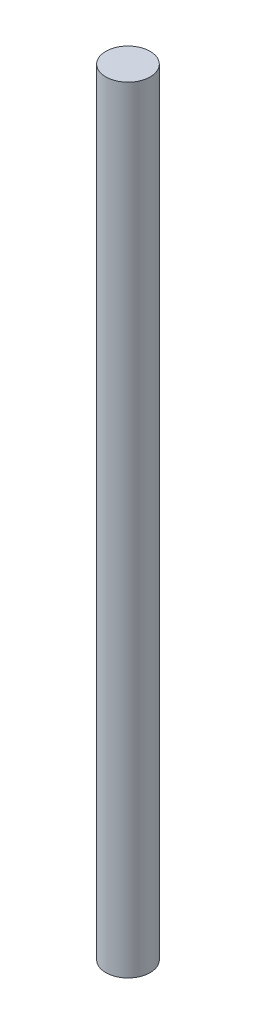
ISO-10303-21;
HEADER;
FILE_DESCRIPTION(('STEP AP214'),'2;1');
FILE_NAME('part.step','',(''),(''),'','','');
FILE_SCHEMA(('AUTOMOTIVE_DESIGN { 1 0 10303 214 1 1 1 1 }'));
ENDSEC;
DATA;
#1=APPLICATION_CONTEXT('core data for automotive mechanical design processes');
#2=APPLICATION_PROTOCOL_DEFINITION('international standard','automotive_design',2000,#1);
#3=PRODUCT_CONTEXT('',#1,'mechanical');
#4=PRODUCT('Part','Part','',(#3));
#5=PRODUCT_RELATED_PRODUCT_CATEGORY('part','',(#4));
#6=PRODUCT_DEFINITION_FORMATION('','',#4);
#7=PRODUCT_DEFINITION_CONTEXT('part definition',#1,'design');
#8=PRODUCT_DEFINITION('design','',#6,#7);
#9=PRODUCT_DEFINITION_SHAPE('','',#8);
#10=(LENGTH_UNIT() NAMED_UNIT(*) SI_UNIT(.MILLI.,.METRE.));
#11=(NAMED_UNIT(*) PLANE_ANGLE_UNIT() SI_UNIT($,.RADIAN.));
#12=(NAMED_UNIT(*) SI_UNIT($,.STERADIAN.) SOLID_ANGLE_UNIT());
#13=UNCERTAINTY_MEASURE_WITH_UNIT(LENGTH_MEASURE(1.E-05),#10,'distance_accuracy_value','');
#14=(GEOMETRIC_REPRESENTATION_CONTEXT(3) GLOBAL_UNCERTAINTY_ASSIGNED_CONTEXT((#13)) GLOBAL_UNIT_ASSIGNED_CONTEXT((#10,
#11,#12)) REPRESENTATION_CONTEXT('',''));
#15=CARTESIAN_POINT('',(0.,0.,0.));
#16=DIRECTION('',(0.,0.,1.));
#17=DIRECTION('',(1.,0.,0.));
#18=AXIS2_PLACEMENT_3D('',#15,#16,#17);
#19=CARTESIAN_POINT('',(0.,35.,0.));
#20=DIRECTION('',(0.,-1.,0.));
#21=DIRECTION('',(0.,0.,-1.));
#22=AXIS2_PLACEMENT_3D('',#19,#20,#21);
#23=CYLINDRICAL_SURFACE('',#22,1.);
#24=CARTESIAN_POINT('',(0.,35.,0.));
#25=DIRECTION('',(0.,1.,0.));
#26=DIRECTION('',(0.,0.,1.));
#27=AXIS2_PLACEMENT_3D('',#24,#25,#26);
#28=CIRCLE('',#27,1.);
#29=CARTESIAN_POINT('',(0.,35.,1.));
#30=VERTEX_POINT('',#29);
#31=EDGE_CURVE('E10',#30,#30,#28,.T.);
#32=ORIENTED_EDGE('',*,*,#31,.F.);
#33=EDGE_LOOP('',(#32));
#34=FACE_BOUND('',#33,.T.);
#35=CARTESIAN_POINT('',(0.,0.,0.));
#36=DIRECTION('',(0.,1.,0.));
#37=DIRECTION('',(0.,0.,1.));
#38=AXIS2_PLACEMENT_3D('',#35,#36,#37);
#39=CIRCLE('',#38,1.);
#40=CARTESIAN_POINT('',(0.,0.,1.));
#41=VERTEX_POINT('',#40);
#42=EDGE_CURVE('E34',#41,#41,#39,.T.);
#43=ORIENTED_EDGE('',*,*,#42,.T.);
#44=EDGE_LOOP('',(#43));
#45=FACE_BOUND('',#44,.T.);
#46=ADVANCED_FACE('F31',(#34,#45),#23,.T.);
#47=CARTESIAN_POINT('',(0.,35.,0.));
#48=DIRECTION('',(0.,1.,0.));
#49=DIRECTION('',(0.,0.,1.));
#50=AXIS2_PLACEMENT_3D('',#47,#48,#49);
#51=PLANE('',#50);
#52=ORIENTED_EDGE('',*,*,#31,.T.);
#53=EDGE_LOOP('',(#52));
#54=FACE_BOUND('',#53,.T.);
#55=ADVANCED_FACE('F46',(#54),#51,.T.);
#56=CARTESIAN_POINT('',(0.,0.,0.));
#57=DIRECTION('',(0.,1.,0.));
#58=DIRECTION('',(0.,0.,1.));
#59=AXIS2_PLACEMENT_3D('',#56,#57,#58);
#60=PLANE('',#59);
#61=ORIENTED_EDGE('',*,*,#42,.F.);
#62=EDGE_LOOP('',(#61));
#63=FACE_BOUND('',#62,.T.);
#64=ADVANCED_FACE('F44',(#63),#60,.F.);
#65=CLOSED_SHELL('',(#46,#55,#64));
#66=MANIFOLD_SOLID_BREP('B2',#65);
#67=ADVANCED_BREP_SHAPE_REPRESENTATION('',(#18,#66),#14);
#68=SHAPE_DEFINITION_REPRESENTATION(#9,#67);
ENDSEC;
END-ISO-10303-21;
